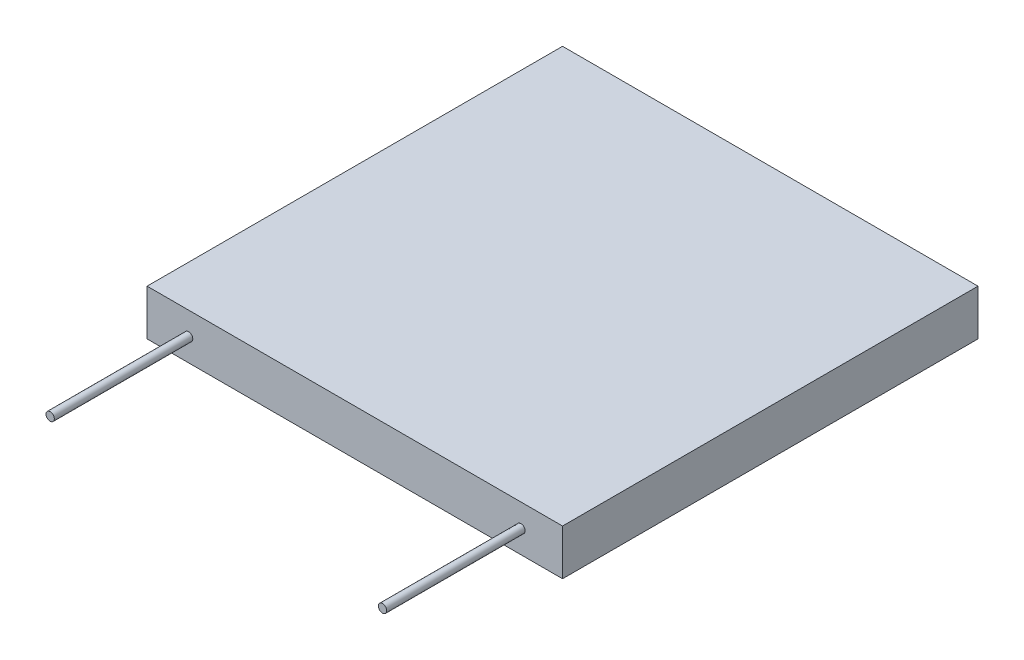
ISO-10303-21;
HEADER;
FILE_DESCRIPTION(('STEP AP214'),'2;1');
FILE_NAME('part.step','',(''),(''),'','','');
FILE_SCHEMA(('AUTOMOTIVE_DESIGN { 1 0 10303 214 1 1 1 1 }'));
ENDSEC;
DATA;
#1=APPLICATION_CONTEXT('core data for automotive mechanical design processes');
#2=APPLICATION_PROTOCOL_DEFINITION('international standard','automotive_design',2000,#1);
#3=PRODUCT_CONTEXT('',#1,'mechanical');
#4=PRODUCT('Part','Part','',(#3));
#5=PRODUCT_RELATED_PRODUCT_CATEGORY('part','',(#4));
#6=PRODUCT_DEFINITION_FORMATION('','',#4);
#7=PRODUCT_DEFINITION_CONTEXT('part definition',#1,'design');
#8=PRODUCT_DEFINITION('design','',#6,#7);
#9=PRODUCT_DEFINITION_SHAPE('','',#8);
#10=(LENGTH_UNIT() NAMED_UNIT(*) SI_UNIT(.MILLI.,.METRE.));
#11=(NAMED_UNIT(*) PLANE_ANGLE_UNIT() SI_UNIT($,.RADIAN.));
#12=(NAMED_UNIT(*) SI_UNIT($,.STERADIAN.) SOLID_ANGLE_UNIT());
#13=UNCERTAINTY_MEASURE_WITH_UNIT(LENGTH_MEASURE(1.E-05),#10,'distance_accuracy_value','');
#14=(GEOMETRIC_REPRESENTATION_CONTEXT(3) GLOBAL_UNCERTAINTY_ASSIGNED_CONTEXT((#13)) GLOBAL_UNIT_ASSIGNED_CONTEXT((#10,
#11,#12)) REPRESENTATION_CONTEXT('',''));
#15=CARTESIAN_POINT('',(0.,0.,0.));
#16=DIRECTION('',(0.,0.,1.));
#17=DIRECTION('',(1.,0.,0.));
#18=AXIS2_PLACEMENT_3D('',#15,#16,#17);
#19=CARTESIAN_POINT('',(-15.,3.3,15.));
#20=DIRECTION('',(0.,0.,-1.));
#21=DIRECTION('',(-1.,0.,0.));
#22=AXIS2_PLACEMENT_3D('',#19,#20,#21);
#23=PLANE('',#22);
#24=CARTESIAN_POINT('',(-12.,1.65,15.));
#25=DIRECTION('',(0.,0.,-1.));
#26=DIRECTION('',(-1.,0.,0.));
#27=AXIS2_PLACEMENT_3D('',#24,#25,#26);
#28=CIRCLE('',#27,0.3);
#29=CARTESIAN_POINT('',(-12.3,1.65,15.));
#30=VERTEX_POINT('',#29);
#31=EDGE_CURVE('E37',#30,#30,#28,.F.);
#32=ORIENTED_EDGE('',*,*,#31,.F.);
#33=EDGE_LOOP('',(#32));
#34=FACE_BOUND('',#33,.T.);
#35=DIRECTION('',(1.,0.,0.));
#36=VECTOR('',#35,1.);
#37=CARTESIAN_POINT('',(-15.,0.,15.));
#38=LINE('',#37,#36);
#39=CARTESIAN_POINT('',(-15.,0.,15.));
#40=VERTEX_POINT('',#39);
#41=CARTESIAN_POINT('',(15.,0.,15.));
#42=VERTEX_POINT('',#41);
#43=EDGE_CURVE('E70',#40,#42,#38,.T.);
#44=ORIENTED_EDGE('',*,*,#43,.T.);
#45=DIRECTION('',(0.,-1.,0.));
#46=VECTOR('',#45,1.);
#47=CARTESIAN_POINT('',(15.,3.3,15.));
#48=LINE('',#47,#46);
#49=CARTESIAN_POINT('',(15.,3.3,15.));
#50=VERTEX_POINT('',#49);
#51=EDGE_CURVE('E87',#50,#42,#48,.T.);
#52=ORIENTED_EDGE('',*,*,#51,.F.);
#53=DIRECTION('',(1.,0.,0.));
#54=VECTOR('',#53,1.);
#55=CARTESIAN_POINT('',(-15.,3.3,15.));
#56=LINE('',#55,#54);
#57=CARTESIAN_POINT('',(-15.,3.3,15.));
#58=VERTEX_POINT('',#57);
#59=EDGE_CURVE('E84',#58,#50,#56,.T.);
#60=ORIENTED_EDGE('',*,*,#59,.F.);
#61=DIRECTION('',(0.,-1.,0.));
#62=VECTOR('',#61,1.);
#63=CARTESIAN_POINT('',(-15.,3.3,15.));
#64=LINE('',#63,#62);
#65=EDGE_CURVE('E82',#58,#40,#64,.T.);
#66=ORIENTED_EDGE('',*,*,#65,.T.);
#67=EDGE_LOOP('',(#44,#52,#60,#66));
#68=FACE_BOUND('',#67,.T.);
#69=CARTESIAN_POINT('',(12.,1.65,15.));
#70=DIRECTION('',(0.,0.,-1.));
#71=DIRECTION('',(-1.,0.,0.));
#72=AXIS2_PLACEMENT_3D('',#69,#70,#71);
#73=CIRCLE('',#72,0.3);
#74=CARTESIAN_POINT('',(11.7,1.65,15.));
#75=VERTEX_POINT('',#74);
#76=EDGE_CURVE('E11',#75,#75,#73,.F.);
#77=ORIENTED_EDGE('',*,*,#76,.F.);
#78=EDGE_LOOP('',(#77));
#79=FACE_BOUND('',#78,.T.);
#80=ADVANCED_FACE('F29',(#34,#68,#79),#23,.F.);
#81=CARTESIAN_POINT('',(-15.,3.3,-15.));
#82=DIRECTION('',(1.,0.,0.));
#83=DIRECTION('',(0.,0.,-1.));
#84=AXIS2_PLACEMENT_3D('',#81,#82,#83);
#85=PLANE('',#84);
#86=DIRECTION('',(0.,0.,1.));
#87=VECTOR('',#86,1.);
#88=CARTESIAN_POINT('',(-15.,0.,-15.));
#89=LINE('',#88,#87);
#90=CARTESIAN_POINT('',(-15.,0.,-15.));
#91=VERTEX_POINT('',#90);
#92=EDGE_CURVE('E75',#91,#40,#89,.T.);
#93=ORIENTED_EDGE('',*,*,#92,.T.);
#94=ORIENTED_EDGE('',*,*,#65,.F.);
#95=DIRECTION('',(0.,0.,1.));
#96=VECTOR('',#95,1.);
#97=CARTESIAN_POINT('',(-15.,3.3,-15.));
#98=LINE('',#97,#96);
#99=CARTESIAN_POINT('',(-15.,3.3,-15.));
#100=VERTEX_POINT('',#99);
#101=EDGE_CURVE('E101',#100,#58,#98,.T.);
#102=ORIENTED_EDGE('',*,*,#101,.F.);
#103=DIRECTION('',(0.,-1.,0.));
#104=VECTOR('',#103,1.);
#105=CARTESIAN_POINT('',(-15.,3.3,-15.));
#106=LINE('',#105,#104);
#107=EDGE_CURVE('E90',#100,#91,#106,.T.);
#108=ORIENTED_EDGE('',*,*,#107,.T.);
#109=EDGE_LOOP('',(#93,#94,#102,#108));
#110=FACE_BOUND('',#109,.T.);
#111=ADVANCED_FACE('F31',(#110),#85,.F.);
#112=CARTESIAN_POINT('',(15.,3.3,-15.));
#113=DIRECTION('',(-1.,0.,0.));
#114=DIRECTION('',(0.,0.,1.));
#115=AXIS2_PLACEMENT_3D('',#112,#113,#114);
#116=PLANE('',#115);
#117=DIRECTION('',(0.,0.,-1.));
#118=VECTOR('',#117,1.);
#119=CARTESIAN_POINT('',(15.,0.,-15.));
#120=LINE('',#119,#118);
#121=CARTESIAN_POINT('',(15.,0.,-15.));
#122=VERTEX_POINT('',#121);
#123=EDGE_CURVE('E76',#42,#122,#120,.T.);
#124=ORIENTED_EDGE('',*,*,#123,.T.);
#125=DIRECTION('',(0.,-1.,0.));
#126=VECTOR('',#125,1.);
#127=CARTESIAN_POINT('',(15.,3.3,-15.));
#128=LINE('',#127,#126);
#129=CARTESIAN_POINT('',(15.,3.3,-15.));
#130=VERTEX_POINT('',#129);
#131=EDGE_CURVE('E107',#130,#122,#128,.T.);
#132=ORIENTED_EDGE('',*,*,#131,.F.);
#133=DIRECTION('',(0.,0.,-1.));
#134=VECTOR('',#133,1.);
#135=CARTESIAN_POINT('',(15.,3.3,-15.));
#136=LINE('',#135,#134);
#137=EDGE_CURVE('E49',#50,#130,#136,.T.);
#138=ORIENTED_EDGE('',*,*,#137,.F.);
#139=ORIENTED_EDGE('',*,*,#51,.T.);
#140=EDGE_LOOP('',(#124,#132,#138,#139));
#141=FACE_BOUND('',#140,.T.);
#142=ADVANCED_FACE('F121',(#141),#116,.F.);
#143=CARTESIAN_POINT('',(-15.,3.3,-15.));
#144=DIRECTION('',(0.,0.,1.));
#145=DIRECTION('',(1.,0.,0.));
#146=AXIS2_PLACEMENT_3D('',#143,#144,#145);
#147=PLANE('',#146);
#148=DIRECTION('',(-1.,0.,0.));
#149=VECTOR('',#148,1.);
#150=CARTESIAN_POINT('',(-15.,0.,-15.));
#151=LINE('',#150,#149);
#152=EDGE_CURVE('E99',#122,#91,#151,.T.);
#153=ORIENTED_EDGE('',*,*,#152,.T.);
#154=ORIENTED_EDGE('',*,*,#107,.F.);
#155=DIRECTION('',(-1.,0.,0.));
#156=VECTOR('',#155,1.);
#157=CARTESIAN_POINT('',(-15.,3.3,-15.));
#158=LINE('',#157,#156);
#159=EDGE_CURVE('E44',#130,#100,#158,.T.);
#160=ORIENTED_EDGE('',*,*,#159,.F.);
#161=ORIENTED_EDGE('',*,*,#131,.T.);
#162=EDGE_LOOP('',(#153,#154,#160,#161));
#163=FACE_BOUND('',#162,.T.);
#164=ADVANCED_FACE('F125',(#163),#147,.F.);
#165=CARTESIAN_POINT('',(-15.,3.3,15.));
#166=DIRECTION('',(0.,1.,0.));
#167=DIRECTION('',(0.,0.,1.));
#168=AXIS2_PLACEMENT_3D('',#165,#166,#167);
#169=PLANE('',#168);
#170=ORIENTED_EDGE('',*,*,#101,.T.);
#171=ORIENTED_EDGE('',*,*,#59,.T.);
#172=ORIENTED_EDGE('',*,*,#137,.T.);
#173=ORIENTED_EDGE('',*,*,#159,.T.);
#174=EDGE_LOOP('',(#170,#171,#172,#173));
#175=FACE_BOUND('',#174,.T.);
#176=ADVANCED_FACE('F129',(#175),#169,.T.);
#177=CARTESIAN_POINT('',(-15.,0.,15.));
#178=DIRECTION('',(0.,1.,0.));
#179=DIRECTION('',(0.,0.,1.));
#180=AXIS2_PLACEMENT_3D('',#177,#178,#179);
#181=PLANE('',#180);
#182=ORIENTED_EDGE('',*,*,#92,.F.);
#183=ORIENTED_EDGE('',*,*,#152,.F.);
#184=ORIENTED_EDGE('',*,*,#123,.F.);
#185=ORIENTED_EDGE('',*,*,#43,.F.);
#186=EDGE_LOOP('',(#182,#183,#184,#185));
#187=FACE_BOUND('',#186,.T.);
#188=ADVANCED_FACE('F72',(#187),#181,.F.);
#189=CARTESIAN_POINT('',(-12.,1.65,25.));
#190=DIRECTION('',(0.,0.,-1.));
#191=DIRECTION('',(-1.,0.,0.));
#192=AXIS2_PLACEMENT_3D('',#189,#190,#191);
#193=CYLINDRICAL_SURFACE('',#192,0.3);
#194=CARTESIAN_POINT('',(-12.,1.65,25.));
#195=DIRECTION('',(0.,0.,1.));
#196=DIRECTION('',(1.,0.,0.));
#197=AXIS2_PLACEMENT_3D('',#194,#195,#196);
#198=CIRCLE('',#197,0.3);
#199=CARTESIAN_POINT('',(-11.7,1.65,25.));
#200=VERTEX_POINT('',#199);
#201=EDGE_CURVE('E91',#200,#200,#198,.T.);
#202=ORIENTED_EDGE('',*,*,#201,.F.);
#203=EDGE_LOOP('',(#202));
#204=FACE_BOUND('',#203,.T.);
#205=ORIENTED_EDGE('',*,*,#31,.T.);
#206=EDGE_LOOP('',(#205));
#207=FACE_BOUND('',#206,.T.);
#208=ADVANCED_FACE('F113',(#204,#207),#193,.T.);
#209=CARTESIAN_POINT('',(-12.,1.65,25.));
#210=DIRECTION('',(0.,0.,1.));
#211=DIRECTION('',(1.,0.,0.));
#212=AXIS2_PLACEMENT_3D('',#209,#210,#211);
#213=PLANE('',#212);
#214=ORIENTED_EDGE('',*,*,#201,.T.);
#215=EDGE_LOOP('',(#214));
#216=FACE_BOUND('',#215,.T.);
#217=ADVANCED_FACE('F135',(#216),#213,.T.);
#218=CARTESIAN_POINT('',(12.,1.65,25.));
#219=DIRECTION('',(0.,0.,-1.));
#220=DIRECTION('',(-1.,0.,0.));
#221=AXIS2_PLACEMENT_3D('',#218,#219,#220);
#222=CYLINDRICAL_SURFACE('',#221,0.3);
#223=CARTESIAN_POINT('',(12.,1.65,25.));
#224=DIRECTION('',(0.,0.,1.));
#225=DIRECTION('',(-1.,0.,0.));
#226=AXIS2_PLACEMENT_3D('',#223,#224,#225);
#227=CIRCLE('',#226,0.3);
#228=CARTESIAN_POINT('',(11.7,1.65,25.));
#229=VERTEX_POINT('',#228);
#230=EDGE_CURVE('E94',#229,#229,#227,.T.);
#231=ORIENTED_EDGE('',*,*,#230,.F.);
#232=EDGE_LOOP('',(#231));
#233=FACE_BOUND('',#232,.T.);
#234=ORIENTED_EDGE('',*,*,#76,.T.);
#235=EDGE_LOOP('',(#234));
#236=FACE_BOUND('',#235,.T.);
#237=ADVANCED_FACE('F139',(#233,#236),#222,.T.);
#238=CARTESIAN_POINT('',(12.,1.65,25.));
#239=DIRECTION('',(0.,0.,-1.));
#240=DIRECTION('',(-1.,0.,0.));
#241=AXIS2_PLACEMENT_3D('',#238,#239,#240);
#242=PLANE('',#241);
#243=ORIENTED_EDGE('',*,*,#230,.T.);
#244=EDGE_LOOP('',(#243));
#245=FACE_BOUND('',#244,.T.);
#246=ADVANCED_FACE('F143',(#245),#242,.F.);
#247=CLOSED_SHELL('',(#80,#111,#142,#164,#176,#188,#208,#217,#237,#246));
#248=MANIFOLD_SOLID_BREP('B2',#247);
#249=ADVANCED_BREP_SHAPE_REPRESENTATION('',(#18,#248),#14);
#250=SHAPE_DEFINITION_REPRESENTATION(#9,#249);
ENDSEC;
END-ISO-10303-21;
